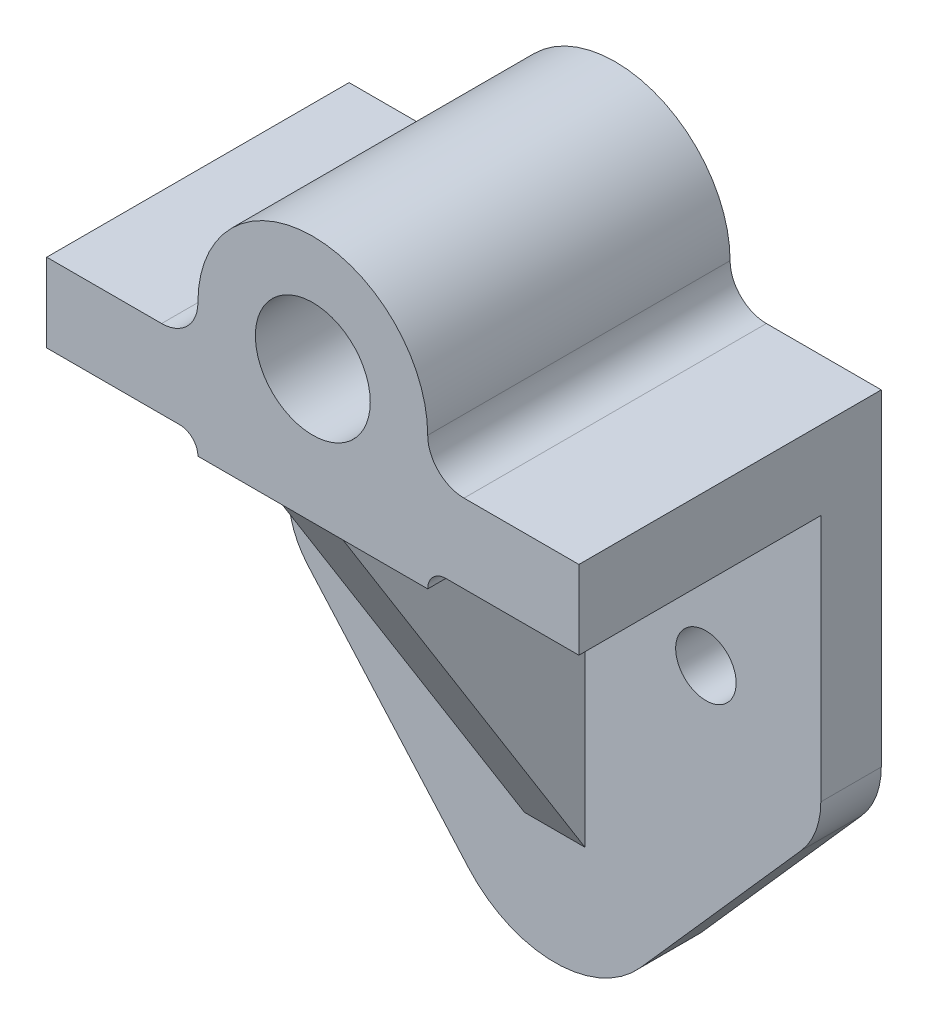
ISO-10303-21;
HEADER;
FILE_DESCRIPTION(('STEP AP214'),'2;1');
FILE_NAME('part.step','',(''),(''),'','','');
FILE_SCHEMA(('AUTOMOTIVE_DESIGN { 1 0 10303 214 1 1 1 1 }'));
ENDSEC;
DATA;
#1=APPLICATION_CONTEXT('core data for automotive mechanical design processes');
#2=APPLICATION_PROTOCOL_DEFINITION('international standard','automotive_design',2000,#1);
#3=PRODUCT_CONTEXT('',#1,'mechanical');
#4=PRODUCT('Part','Part','',(#3));
#5=PRODUCT_RELATED_PRODUCT_CATEGORY('part','',(#4));
#6=PRODUCT_DEFINITION_FORMATION('','',#4);
#7=PRODUCT_DEFINITION_CONTEXT('part definition',#1,'design');
#8=PRODUCT_DEFINITION('design','',#6,#7);
#9=PRODUCT_DEFINITION_SHAPE('','',#8);
#10=(LENGTH_UNIT() NAMED_UNIT(*) SI_UNIT(.MILLI.,.METRE.));
#11=(NAMED_UNIT(*) PLANE_ANGLE_UNIT() SI_UNIT($,.RADIAN.));
#12=(NAMED_UNIT(*) SI_UNIT($,.STERADIAN.) SOLID_ANGLE_UNIT());
#13=UNCERTAINTY_MEASURE_WITH_UNIT(LENGTH_MEASURE(1.E-05),#10,'distance_accuracy_value','');
#14=(GEOMETRIC_REPRESENTATION_CONTEXT(3) GLOBAL_UNCERTAINTY_ASSIGNED_CONTEXT((#13)) GLOBAL_UNIT_ASSIGNED_CONTEXT((#10,
#11,#12)) REPRESENTATION_CONTEXT('',''));
#15=CARTESIAN_POINT('',(0.,0.,0.));
#16=DIRECTION('',(0.,0.,1.));
#17=DIRECTION('',(1.,0.,0.));
#18=AXIS2_PLACEMENT_3D('',#15,#16,#17);
#19=CARTESIAN_POINT('',(0.,-22.,50.));
#20=DIRECTION('',(0.,1.,0.));
#21=DIRECTION('',(0.,0.,1.));
#22=AXIS2_PLACEMENT_3D('',#19,#20,#21);
#23=PLANE('',#22);
#24=DIRECTION('',(0.,0.,-1.));
#25=VECTOR('',#24,1.);
#26=CARTESIAN_POINT('',(-5.,-22.,50.));
#27=LINE('',#26,#25);
#28=CARTESIAN_POINT('',(-5.,-22.,50.));
#29=VERTEX_POINT('',#28);
#30=CARTESIAN_POINT('',(-5.,-22.,10.));
#31=VERTEX_POINT('',#30);
#32=EDGE_CURVE('E196',#29,#31,#27,.T.);
#33=ORIENTED_EDGE('',*,*,#32,.F.);
#34=DIRECTION('',(1.,0.,0.));
#35=VECTOR('',#34,1.);
#36=CARTESIAN_POINT('',(0.,-22.,50.));
#37=LINE('',#36,#35);
#38=CARTESIAN_POINT('',(-19.,-22.,50.));
#39=VERTEX_POINT('',#38);
#40=EDGE_CURVE('E190',#39,#29,#37,.T.);
#41=ORIENTED_EDGE('',*,*,#40,.F.);
#42=DIRECTION('',(0.,0.,-1.));
#43=VECTOR('',#42,1.);
#44=CARTESIAN_POINT('',(-19.,-22.,50.));
#45=LINE('',#44,#43);
#46=CARTESIAN_POINT('',(-19.,-22.,10.));
#47=VERTEX_POINT('',#46);
#48=EDGE_CURVE('E355',#39,#47,#45,.T.);
#49=ORIENTED_EDGE('',*,*,#48,.T.);
#50=DIRECTION('',(1.,0.,0.));
#51=VECTOR('',#50,1.);
#52=CARTESIAN_POINT('',(0.,-22.,10.));
#53=LINE('',#52,#51);
#54=EDGE_CURVE('E206',#47,#31,#53,.T.);
#55=ORIENTED_EDGE('',*,*,#54,.T.);
#56=EDGE_LOOP('',(#33,#41,#49,#55));
#57=FACE_BOUND('',#56,.T.);
#58=ADVANCED_FACE('F38',(#57),#23,.F.);
#59=CARTESIAN_POINT('',(-31.,-60.,10.));
#60=DIRECTION('',(0.,0.,-1.));
#61=DIRECTION('',(-1.,0.,0.));
#62=AXIS2_PLACEMENT_3D('',#59,#60,#61);
#63=CYLINDRICAL_SURFACE('',#62,13.);
#64=CARTESIAN_POINT('',(-31.,-60.,0.));
#65=DIRECTION('',(0.,0.,1.));
#66=DIRECTION('',(1.,0.,0.));
#67=AXIS2_PLACEMENT_3D('',#64,#65,#66);
#68=CIRCLE('',#67,13.);
#69=CARTESIAN_POINT('',(-40.7386831643555,-68.6115068498085,0.));
#70=VERTEX_POINT('',#69);
#71=CARTESIAN_POINT('',(-44.,-60.,0.));
#72=VERTEX_POINT('',#71);
#73=EDGE_CURVE('E274',#70,#72,#68,.F.);
#74=ORIENTED_EDGE('',*,*,#73,.F.);
#75=DIRECTION('',(0.,0.,-1.));
#76=VECTOR('',#75,1.);
#77=CARTESIAN_POINT('',(-40.7386831643555,-68.6115068498085,10.));
#78=LINE('',#77,#76);
#79=CARTESIAN_POINT('',(-40.7386831643555,-68.6115068498085,10.));
#80=VERTEX_POINT('',#79);
#81=EDGE_CURVE('E304',#80,#70,#78,.T.);
#82=ORIENTED_EDGE('',*,*,#81,.F.);
#83=CARTESIAN_POINT('',(-31.,-60.,10.));
#84=DIRECTION('',(0.,0.,1.));
#85=DIRECTION('',(1.,0.,0.));
#86=AXIS2_PLACEMENT_3D('',#83,#84,#85);
#87=CIRCLE('',#86,13.);
#88=CARTESIAN_POINT('',(-44.,-60.,10.));
#89=VERTEX_POINT('',#88);
#90=EDGE_CURVE('E336',#80,#89,#87,.F.);
#91=ORIENTED_EDGE('',*,*,#90,.T.);
#92=DIRECTION('',(0.,0.,-1.));
#93=VECTOR('',#92,1.);
#94=CARTESIAN_POINT('',(-44.,-60.,10.));
#95=LINE('',#94,#93);
#96=EDGE_CURVE('E266',#89,#72,#95,.T.);
#97=ORIENTED_EDGE('',*,*,#96,.T.);
#98=EDGE_LOOP('',(#74,#82,#91,#97));
#99=FACE_BOUND('',#98,.T.);
#100=ADVANCED_FACE('F428',(#99),#63,.T.);
#101=CARTESIAN_POINT('',(-56.9101899674589,-50.3232811313158,10.));
#102=DIRECTION('',(-0.749129474181193,-0.662423603831423,0.));
#103=DIRECTION('',(0.662423603831423,-0.749129474181193,0.));
#104=AXIS2_PLACEMENT_3D('',#101,#102,#103);
#105=PLANE('',#104);
#106=DIRECTION('',(-0.662423603831423,0.749129474181193,0.));
#107=VECTOR('',#106,1.);
#108=CARTESIAN_POINT('',(-56.9101899674589,-50.3232811313158,0.));
#109=LINE('',#108,#107);
#110=CARTESIAN_POINT('',(-14.2334600094427,-98.586048472797,0.));
#111=VERTEX_POINT('',#110);
#112=EDGE_CURVE('E277',#111,#70,#109,.T.);
#113=ORIENTED_EDGE('',*,*,#112,.F.);
#114=DIRECTION('',(0.,0.,-1.));
#115=VECTOR('',#114,1.);
#116=CARTESIAN_POINT('',(-14.2334600094427,-98.586048472797,10.));
#117=LINE('',#116,#115);
#118=CARTESIAN_POINT('',(-14.2334600094427,-98.586048472797,10.));
#119=VERTEX_POINT('',#118);
#120=EDGE_CURVE('E302',#119,#111,#117,.T.);
#121=ORIENTED_EDGE('',*,*,#120,.F.);
#122=DIRECTION('',(-0.662423603831423,0.749129474181193,0.));
#123=VECTOR('',#122,1.);
#124=CARTESIAN_POINT('',(-56.9101899674589,-50.3232811313158,10.));
#125=LINE('',#124,#123);
#126=EDGE_CURVE('E333',#119,#80,#125,.T.);
#127=ORIENTED_EDGE('',*,*,#126,.T.);
#128=ORIENTED_EDGE('',*,*,#81,.T.);
#129=EDGE_LOOP('',(#113,#121,#127,#128));
#130=FACE_BOUND('',#129,.T.);
#131=ADVANCED_FACE('F432',(#130),#105,.T.);
#132=CARTESIAN_POINT('',(0.,-86.,10.));
#133=DIRECTION('',(0.,0.,-1.));
#134=DIRECTION('',(-1.,0.,0.));
#135=AXIS2_PLACEMENT_3D('',#132,#133,#134);
#136=CYLINDRICAL_SURFACE('',#135,19.);
#137=CARTESIAN_POINT('',(0.,-86.,0.));
#138=DIRECTION('',(0.,0.,1.));
#139=DIRECTION('',(1.,0.,0.));
#140=AXIS2_PLACEMENT_3D('',#137,#138,#139);
#141=CIRCLE('',#140,19.);
#142=CARTESIAN_POINT('',(14.2334600094427,-98.586048472797,0.));
#143=VERTEX_POINT('',#142);
#144=EDGE_CURVE('E280',#143,#111,#141,.F.);
#145=ORIENTED_EDGE('',*,*,#144,.F.);
#146=DIRECTION('',(0.,0.,-1.));
#147=VECTOR('',#146,1.);
#148=CARTESIAN_POINT('',(14.2334600094427,-98.586048472797,10.));
#149=LINE('',#148,#147);
#150=CARTESIAN_POINT('',(14.2334600094427,-98.586048472797,10.));
#151=VERTEX_POINT('',#150);
#152=EDGE_CURVE('E300',#151,#143,#149,.T.);
#153=ORIENTED_EDGE('',*,*,#152,.F.);
#154=CARTESIAN_POINT('',(0.,-86.,10.));
#155=DIRECTION('',(0.,0.,1.));
#156=DIRECTION('',(1.,0.,0.));
#157=AXIS2_PLACEMENT_3D('',#154,#155,#156);
#158=CIRCLE('',#157,19.);
#159=EDGE_CURVE('E330',#151,#119,#158,.F.);
#160=ORIENTED_EDGE('',*,*,#159,.T.);
#161=ORIENTED_EDGE('',*,*,#120,.T.);
#162=EDGE_LOOP('',(#145,#153,#160,#161));
#163=FACE_BOUND('',#162,.T.);
#164=ADVANCED_FACE('F616',(#163),#136,.T.);
#165=CARTESIAN_POINT('',(56.9101899674589,-50.3232811313158,10.));
#166=DIRECTION('',(0.749129474181193,-0.662423603831423,0.));
#167=DIRECTION('',(0.662423603831423,0.749129474181193,0.));
#168=AXIS2_PLACEMENT_3D('',#165,#166,#167);
#169=PLANE('',#168);
#170=DIRECTION('',(-0.662423603831423,-0.749129474181193,0.));
#171=VECTOR('',#170,1.);
#172=CARTESIAN_POINT('',(56.9101899674589,-50.3232811313158,0.));
#173=LINE('',#172,#171);
#174=CARTESIAN_POINT('',(40.7386831643555,-68.6115068498085,0.));
#175=VERTEX_POINT('',#174);
#176=EDGE_CURVE('E283',#175,#143,#173,.T.);
#177=ORIENTED_EDGE('',*,*,#176,.F.);
#178=DIRECTION('',(0.,0.,-1.));
#179=VECTOR('',#178,1.);
#180=CARTESIAN_POINT('',(40.7386831643555,-68.6115068498085,10.));
#181=LINE('',#180,#179);
#182=CARTESIAN_POINT('',(40.7386831643555,-68.6115068498085,10.));
#183=VERTEX_POINT('',#182);
#184=EDGE_CURVE('E298',#183,#175,#181,.T.);
#185=ORIENTED_EDGE('',*,*,#184,.F.);
#186=DIRECTION('',(-0.662423603831423,-0.749129474181193,0.));
#187=VECTOR('',#186,1.);
#188=CARTESIAN_POINT('',(56.9101899674589,-50.3232811313158,10.));
#189=LINE('',#188,#187);
#190=EDGE_CURVE('E325',#183,#151,#189,.T.);
#191=ORIENTED_EDGE('',*,*,#190,.T.);
#192=ORIENTED_EDGE('',*,*,#152,.T.);
#193=EDGE_LOOP('',(#177,#185,#191,#192));
#194=FACE_BOUND('',#193,.T.);
#195=ADVANCED_FACE('F606',(#194),#169,.T.);
#196=CARTESIAN_POINT('',(31.,-60.,10.));
#197=DIRECTION('',(0.,0.,-1.));
#198=DIRECTION('',(-1.,0.,0.));
#199=AXIS2_PLACEMENT_3D('',#196,#197,#198);
#200=CYLINDRICAL_SURFACE('',#199,13.);
#201=CARTESIAN_POINT('',(31.,-60.,0.));
#202=DIRECTION('',(0.,0.,1.));
#203=DIRECTION('',(1.,0.,0.));
#204=AXIS2_PLACEMENT_3D('',#201,#202,#203);
#205=CIRCLE('',#204,13.);
#206=CARTESIAN_POINT('',(44.,-60.,0.));
#207=VERTEX_POINT('',#206);
#208=EDGE_CURVE('E286',#207,#175,#205,.F.);
#209=ORIENTED_EDGE('',*,*,#208,.F.);
#210=DIRECTION('',(0.,0.,-1.));
#211=VECTOR('',#210,1.);
#212=CARTESIAN_POINT('',(44.,-60.,10.));
#213=LINE('',#212,#211);
#214=CARTESIAN_POINT('',(44.,-60.,10.));
#215=VERTEX_POINT('',#214);
#216=EDGE_CURVE('E296',#215,#207,#213,.T.);
#217=ORIENTED_EDGE('',*,*,#216,.F.);
#218=CARTESIAN_POINT('',(31.,-60.,10.));
#219=DIRECTION('',(0.,0.,1.));
#220=DIRECTION('',(1.,0.,0.));
#221=AXIS2_PLACEMENT_3D('',#218,#219,#220);
#222=CIRCLE('',#221,13.);
#223=EDGE_CURVE('E323',#215,#183,#222,.F.);
#224=ORIENTED_EDGE('',*,*,#223,.T.);
#225=ORIENTED_EDGE('',*,*,#184,.T.);
#226=EDGE_LOOP('',(#209,#217,#224,#225));
#227=FACE_BOUND('',#226,.T.);
#228=ADVANCED_FACE('F578',(#227),#200,.T.);
#229=CARTESIAN_POINT('',(44.,0.,10.));
#230=DIRECTION('',(1.,0.,0.));
#231=DIRECTION('',(0.,0.,-1.));
#232=AXIS2_PLACEMENT_3D('',#229,#230,#231);
#233=PLANE('',#232);
#234=DIRECTION('',(0.,-1.,0.));
#235=VECTOR('',#234,1.);
#236=CARTESIAN_POINT('',(44.,0.,0.));
#237=LINE('',#236,#235);
#238=CARTESIAN_POINT('',(44.,-6.,0.));
#239=VERTEX_POINT('',#238);
#240=EDGE_CURVE('E289',#239,#207,#237,.T.);
#241=ORIENTED_EDGE('',*,*,#240,.F.);
#242=DIRECTION('',(0.,0.,-1.));
#243=VECTOR('',#242,1.);
#244=CARTESIAN_POINT('',(44.,-6.,50.));
#245=LINE('',#244,#243);
#246=CARTESIAN_POINT('',(44.,-6.,50.));
#247=VERTEX_POINT('',#246);
#248=EDGE_CURVE('E361',#247,#239,#245,.T.);
#249=ORIENTED_EDGE('',*,*,#248,.F.);
#250=DIRECTION('',(0.,-1.,0.));
#251=VECTOR('',#250,1.);
#252=CARTESIAN_POINT('',(44.,0.,50.));
#253=LINE('',#252,#251);
#254=CARTESIAN_POINT('',(44.,-19.,50.));
#255=VERTEX_POINT('',#254);
#256=EDGE_CURVE('E211',#247,#255,#253,.T.);
#257=ORIENTED_EDGE('',*,*,#256,.T.);
#258=DIRECTION('',(0.,0.,-1.));
#259=VECTOR('',#258,1.);
#260=CARTESIAN_POINT('',(44.,-19.,50.));
#261=LINE('',#260,#259);
#262=CARTESIAN_POINT('',(44.,-19.,10.));
#263=VERTEX_POINT('',#262);
#264=EDGE_CURVE('E359',#255,#263,#261,.T.);
#265=ORIENTED_EDGE('',*,*,#264,.T.);
#266=DIRECTION('',(0.,-1.,0.));
#267=VECTOR('',#266,1.);
#268=CARTESIAN_POINT('',(44.,0.,10.));
#269=LINE('',#268,#267);
#270=EDGE_CURVE('E258',#263,#215,#269,.T.);
#271=ORIENTED_EDGE('',*,*,#270,.T.);
#272=ORIENTED_EDGE('',*,*,#216,.T.);
#273=EDGE_LOOP('',(#241,#249,#257,#265,#271,#272));
#274=FACE_BOUND('',#273,.T.);
#275=ADVANCED_FACE('F389',(#274),#233,.T.);
#276=CARTESIAN_POINT('',(-25.,-50.,10.));
#277=DIRECTION('',(0.,0.,-1.));
#278=DIRECTION('',(-1.,0.,0.));
#279=AXIS2_PLACEMENT_3D('',#276,#277,#278);
#280=CYLINDRICAL_SURFACE('',#279,5.);
#281=CARTESIAN_POINT('',(-25.,-50.,10.));
#282=DIRECTION('',(0.,0.,1.));
#283=DIRECTION('',(1.,0.,0.));
#284=AXIS2_PLACEMENT_3D('',#281,#282,#283);
#285=CIRCLE('',#284,5.);
#286=CARTESIAN_POINT('',(-20.,-50.,10.));
#287=VERTEX_POINT('',#286);
#288=EDGE_CURVE('E339',#287,#287,#285,.T.);
#289=ORIENTED_EDGE('',*,*,#288,.T.);
#290=EDGE_LOOP('',(#289));
#291=FACE_BOUND('',#290,.T.);
#292=CARTESIAN_POINT('',(-25.,-50.,0.));
#293=DIRECTION('',(0.,0.,1.));
#294=DIRECTION('',(1.,0.,0.));
#295=AXIS2_PLACEMENT_3D('',#292,#293,#294);
#296=CIRCLE('',#295,5.);
#297=CARTESIAN_POINT('',(-20.,-50.,0.));
#298=VERTEX_POINT('',#297);
#299=EDGE_CURVE('E270',#298,#298,#296,.T.);
#300=ORIENTED_EDGE('',*,*,#299,.F.);
#301=EDGE_LOOP('',(#300));
#302=FACE_BOUND('',#301,.T.);
#303=ADVANCED_FACE('F577',(#291,#302),#280,.F.);
#304=CARTESIAN_POINT('',(25.,-50.,10.));
#305=DIRECTION('',(0.,0.,-1.));
#306=DIRECTION('',(-1.,0.,0.));
#307=AXIS2_PLACEMENT_3D('',#304,#305,#306);
#308=CYLINDRICAL_SURFACE('',#307,5.);
#309=CARTESIAN_POINT('',(25.,-50.,10.));
#310=DIRECTION('',(0.,0.,1.));
#311=DIRECTION('',(1.,0.,0.));
#312=AXIS2_PLACEMENT_3D('',#309,#310,#311);
#313=CIRCLE('',#312,5.);
#314=CARTESIAN_POINT('',(30.,-50.,10.));
#315=VERTEX_POINT('',#314);
#316=EDGE_CURVE('E294',#315,#315,#313,.T.);
#317=ORIENTED_EDGE('',*,*,#316,.T.);
#318=EDGE_LOOP('',(#317));
#319=FACE_BOUND('',#318,.T.);
#320=CARTESIAN_POINT('',(25.,-50.,0.));
#321=DIRECTION('',(0.,0.,1.));
#322=DIRECTION('',(1.,0.,0.));
#323=AXIS2_PLACEMENT_3D('',#320,#321,#322);
#324=CIRCLE('',#323,5.);
#325=CARTESIAN_POINT('',(30.,-50.,0.));
#326=VERTEX_POINT('',#325);
#327=EDGE_CURVE('E267',#326,#326,#324,.T.);
#328=ORIENTED_EDGE('',*,*,#327,.F.);
#329=EDGE_LOOP('',(#328));
#330=FACE_BOUND('',#329,.T.);
#331=ADVANCED_FACE('F566',(#319,#330),#308,.F.);
#332=CARTESIAN_POINT('',(-44.,0.,10.));
#333=DIRECTION('',(-1.,0.,0.));
#334=DIRECTION('',(0.,-1.,0.));
#335=AXIS2_PLACEMENT_3D('',#332,#333,#334);
#336=PLANE('',#335);
#337=DIRECTION('',(0.,1.,0.));
#338=VECTOR('',#337,1.);
#339=CARTESIAN_POINT('',(-44.,0.,0.));
#340=LINE('',#339,#338);
#341=CARTESIAN_POINT('',(-44.,-6.,0.));
#342=VERTEX_POINT('',#341);
#343=EDGE_CURVE('E292',#72,#342,#340,.T.);
#344=ORIENTED_EDGE('',*,*,#343,.F.);
#345=ORIENTED_EDGE('',*,*,#96,.F.);
#346=DIRECTION('',(0.,1.,0.));
#347=VECTOR('',#346,1.);
#348=CARTESIAN_POINT('',(-44.,0.,10.));
#349=LINE('',#348,#347);
#350=CARTESIAN_POINT('',(-44.,-19.,10.));
#351=VERTEX_POINT('',#350);
#352=EDGE_CURVE('E263',#89,#351,#349,.T.);
#353=ORIENTED_EDGE('',*,*,#352,.T.);
#354=DIRECTION('',(0.,0.,-1.));
#355=VECTOR('',#354,1.);
#356=CARTESIAN_POINT('',(-44.,-19.,50.));
#357=LINE('',#356,#355);
#358=CARTESIAN_POINT('',(-44.,-19.,50.));
#359=VERTEX_POINT('',#358);
#360=EDGE_CURVE('E353',#359,#351,#357,.T.);
#361=ORIENTED_EDGE('',*,*,#360,.F.);
#362=DIRECTION('',(0.,1.,0.));
#363=VECTOR('',#362,1.);
#364=CARTESIAN_POINT('',(-44.,0.,50.));
#365=LINE('',#364,#363);
#366=CARTESIAN_POINT('',(-44.,-6.,50.));
#367=VERTEX_POINT('',#366);
#368=EDGE_CURVE('E217',#359,#367,#365,.T.);
#369=ORIENTED_EDGE('',*,*,#368,.T.);
#370=DIRECTION('',(0.,0.,-1.));
#371=VECTOR('',#370,1.);
#372=CARTESIAN_POINT('',(-44.,-6.,50.));
#373=LINE('',#372,#371);
#374=EDGE_CURVE('E350',#367,#342,#373,.T.);
#375=ORIENTED_EDGE('',*,*,#374,.T.);
#376=EDGE_LOOP('',(#344,#345,#353,#361,#369,#375));
#377=FACE_BOUND('',#376,.T.);
#378=ADVANCED_FACE('F414',(#377),#336,.T.);
#379=CARTESIAN_POINT('',(0.,0.,10.));
#380=DIRECTION('',(0.,0.,1.));
#381=DIRECTION('',(1.,0.,0.));
#382=AXIS2_PLACEMENT_3D('',#379,#380,#381);
#383=PLANE('',#382);
#384=ORIENTED_EDGE('',*,*,#54,.F.);
#385=CARTESIAN_POINT('',(-22.,-22.,10.));
#386=DIRECTION('',(0.,0.,1.));
#387=DIRECTION('',(1.,0.,0.));
#388=AXIS2_PLACEMENT_3D('',#385,#386,#387);
#389=CIRCLE('',#388,3.);
#390=CARTESIAN_POINT('',(-22.,-19.,10.));
#391=VERTEX_POINT('',#390);
#392=EDGE_CURVE('E307',#47,#391,#389,.T.);
#393=ORIENTED_EDGE('',*,*,#392,.T.);
#394=DIRECTION('',(1.,0.,0.));
#395=VECTOR('',#394,1.);
#396=CARTESIAN_POINT('',(0.,-19.,10.));
#397=LINE('',#396,#395);
#398=EDGE_CURVE('E257',#351,#391,#397,.T.);
#399=ORIENTED_EDGE('',*,*,#398,.F.);
#400=ORIENTED_EDGE('',*,*,#352,.F.);
#401=ORIENTED_EDGE('',*,*,#90,.F.);
#402=ORIENTED_EDGE('',*,*,#126,.F.);
#403=ORIENTED_EDGE('',*,*,#159,.F.);
#404=ORIENTED_EDGE('',*,*,#190,.F.);
#405=ORIENTED_EDGE('',*,*,#223,.F.);
#406=ORIENTED_EDGE('',*,*,#270,.F.);
#407=DIRECTION('',(1.,0.,0.));
#408=VECTOR('',#407,1.);
#409=CARTESIAN_POINT('',(0.,-19.,10.));
#410=LINE('',#409,#408);
#411=CARTESIAN_POINT('',(22.,-19.,10.));
#412=VERTEX_POINT('',#411);
#413=EDGE_CURVE('E255',#412,#263,#410,.T.);
#414=ORIENTED_EDGE('',*,*,#413,.F.);
#415=CARTESIAN_POINT('',(22.,-22.,10.));
#416=DIRECTION('',(0.,0.,1.));
#417=DIRECTION('',(1.,0.,0.));
#418=AXIS2_PLACEMENT_3D('',#415,#416,#417);
#419=CIRCLE('',#418,3.);
#420=CARTESIAN_POINT('',(19.,-22.,10.));
#421=VERTEX_POINT('',#420);
#422=EDGE_CURVE('E252',#412,#421,#419,.T.);
#423=ORIENTED_EDGE('',*,*,#422,.T.);
#424=CARTESIAN_POINT('',(5.,-22.,10.));
#425=VERTEX_POINT('',#424);
#426=EDGE_CURVE('E250',#425,#421,#53,.T.);
#427=ORIENTED_EDGE('',*,*,#426,.F.);
#428=DIRECTION('',(0.,1.,0.));
#429=VECTOR('',#428,1.);
#430=CARTESIAN_POINT('',(5.,0.,10.));
#431=LINE('',#430,#429);
#432=CARTESIAN_POINT('',(5.,-86.,10.));
#433=VERTEX_POINT('',#432);
#434=EDGE_CURVE('E236',#433,#425,#431,.T.);
#435=ORIENTED_EDGE('',*,*,#434,.F.);
#436=DIRECTION('',(1.,0.,0.));
#437=VECTOR('',#436,1.);
#438=CARTESIAN_POINT('',(0.,-86.,10.));
#439=LINE('',#438,#437);
#440=CARTESIAN_POINT('',(-5.,-86.,10.));
#441=VERTEX_POINT('',#440);
#442=EDGE_CURVE('E233',#441,#433,#439,.T.);
#443=ORIENTED_EDGE('',*,*,#442,.F.);
#444=DIRECTION('',(0.,1.,0.));
#445=VECTOR('',#444,1.);
#446=CARTESIAN_POINT('',(-5.,0.,10.));
#447=LINE('',#446,#445);
#448=EDGE_CURVE('E198',#441,#31,#447,.T.);
#449=ORIENTED_EDGE('',*,*,#448,.T.);
#450=EDGE_LOOP('',(#384,#393,#399,#400,#401,#402,#403,#404,#405,#406,#414,#423,#427,#435,#443,#449));
#451=FACE_BOUND('',#450,.T.);
#452=ORIENTED_EDGE('',*,*,#316,.F.);
#453=EDGE_LOOP('',(#452));
#454=FACE_BOUND('',#453,.T.);
#455=ORIENTED_EDGE('',*,*,#288,.F.);
#456=EDGE_LOOP('',(#455));
#457=FACE_BOUND('',#456,.T.);
#458=ADVANCED_FACE('F247',(#451,#454,#457),#383,.T.);
#459=CARTESIAN_POINT('',(0.,0.,0.));
#460=DIRECTION('',(0.,0.,1.));
#461=DIRECTION('',(1.,0.,0.));
#462=AXIS2_PLACEMENT_3D('',#459,#460,#461);
#463=PLANE('',#462);
#464=CARTESIAN_POINT('',(0.,0.,0.));
#465=DIRECTION('',(0.,0.,1.));
#466=DIRECTION('',(1.,0.,0.));
#467=AXIS2_PLACEMENT_3D('',#464,#465,#466);
#468=CIRCLE('',#467,9.5);
#469=CARTESIAN_POINT('',(9.5,0.,0.));
#470=VERTEX_POINT('',#469);
#471=EDGE_CURVE('E232',#470,#470,#468,.T.);
#472=ORIENTED_EDGE('',*,*,#471,.T.);
#473=EDGE_LOOP('',(#472));
#474=FACE_BOUND('',#473,.T.);
#475=CARTESIAN_POINT('',(-25.,0.,0.));
#476=DIRECTION('',(0.,0.,1.));
#477=DIRECTION('',(1.,0.,0.));
#478=AXIS2_PLACEMENT_3D('',#475,#476,#477);
#479=CIRCLE('',#478,6.);
#480=CARTESIAN_POINT('',(-19.,0.,0.));
#481=VERTEX_POINT('',#480);
#482=CARTESIAN_POINT('',(-25.,-6.,0.));
#483=VERTEX_POINT('',#482);
#484=EDGE_CURVE('E375',#481,#483,#479,.F.);
#485=ORIENTED_EDGE('',*,*,#484,.F.);
#486=CARTESIAN_POINT('',(0.,0.,0.));
#487=DIRECTION('',(0.,0.,1.));
#488=DIRECTION('',(1.,0.,0.));
#489=AXIS2_PLACEMENT_3D('',#486,#487,#488);
#490=CIRCLE('',#489,19.);
#491=CARTESIAN_POINT('',(19.,0.,0.));
#492=VERTEX_POINT('',#491);
#493=EDGE_CURVE('E378',#492,#481,#490,.T.);
#494=ORIENTED_EDGE('',*,*,#493,.F.);
#495=CARTESIAN_POINT('',(25.,0.,0.));
#496=DIRECTION('',(0.,0.,1.));
#497=DIRECTION('',(1.,0.,0.));
#498=AXIS2_PLACEMENT_3D('',#495,#496,#497);
#499=CIRCLE('',#498,6.);
#500=CARTESIAN_POINT('',(25.,-6.,0.));
#501=VERTEX_POINT('',#500);
#502=EDGE_CURVE('E235',#492,#501,#499,.T.);
#503=ORIENTED_EDGE('',*,*,#502,.T.);
#504=DIRECTION('',(1.,0.,0.));
#505=VECTOR('',#504,1.);
#506=CARTESIAN_POINT('',(0.,-6.,0.));
#507=LINE('',#506,#505);
#508=EDGE_CURVE('E369',#501,#239,#507,.T.);
#509=ORIENTED_EDGE('',*,*,#508,.T.);
#510=ORIENTED_EDGE('',*,*,#240,.T.);
#511=ORIENTED_EDGE('',*,*,#208,.T.);
#512=ORIENTED_EDGE('',*,*,#176,.T.);
#513=ORIENTED_EDGE('',*,*,#144,.T.);
#514=ORIENTED_EDGE('',*,*,#112,.T.);
#515=ORIENTED_EDGE('',*,*,#73,.T.);
#516=ORIENTED_EDGE('',*,*,#343,.T.);
#517=DIRECTION('',(1.,0.,0.));
#518=VECTOR('',#517,1.);
#519=CARTESIAN_POINT('',(0.,-6.,0.));
#520=LINE('',#519,#518);
#521=EDGE_CURVE('E372',#342,#483,#520,.T.);
#522=ORIENTED_EDGE('',*,*,#521,.T.);
#523=EDGE_LOOP('',(#485,#494,#503,#509,#510,#511,#512,#513,#514,#515,#516,#522));
#524=FACE_BOUND('',#523,.T.);
#525=ORIENTED_EDGE('',*,*,#327,.T.);
#526=EDGE_LOOP('',(#525));
#527=FACE_BOUND('',#526,.T.);
#528=ORIENTED_EDGE('',*,*,#299,.T.);
#529=EDGE_LOOP('',(#528));
#530=FACE_BOUND('',#529,.T.);
#531=ADVANCED_FACE('F546',(#474,#524,#527,#530),#463,.F.);
#532=CARTESIAN_POINT('',(25.,0.,50.));
#533=DIRECTION('',(0.,0.,-1.));
#534=DIRECTION('',(-1.,0.,0.));
#535=AXIS2_PLACEMENT_3D('',#532,#533,#534);
#536=CYLINDRICAL_SURFACE('',#535,6.);
#537=ORIENTED_EDGE('',*,*,#502,.F.);
#538=DIRECTION('',(0.,0.,-1.));
#539=VECTOR('',#538,1.);
#540=CARTESIAN_POINT('',(19.,0.,50.));
#541=LINE('',#540,#539);
#542=CARTESIAN_POINT('',(19.,0.,50.));
#543=VERTEX_POINT('',#542);
#544=EDGE_CURVE('E271',#543,#492,#541,.T.);
#545=ORIENTED_EDGE('',*,*,#544,.F.);
#546=CARTESIAN_POINT('',(25.,0.,50.));
#547=DIRECTION('',(0.,0.,1.));
#548=DIRECTION('',(1.,0.,0.));
#549=AXIS2_PLACEMENT_3D('',#546,#547,#548);
#550=CIRCLE('',#549,6.);
#551=CARTESIAN_POINT('',(25.,-6.,50.));
#552=VERTEX_POINT('',#551);
#553=EDGE_CURVE('E229',#543,#552,#550,.T.);
#554=ORIENTED_EDGE('',*,*,#553,.T.);
#555=DIRECTION('',(0.,0.,-1.));
#556=VECTOR('',#555,1.);
#557=CARTESIAN_POINT('',(25.,-6.,50.));
#558=LINE('',#557,#556);
#559=EDGE_CURVE('E364',#552,#501,#558,.T.);
#560=ORIENTED_EDGE('',*,*,#559,.T.);
#561=EDGE_LOOP('',(#537,#545,#554,#560));
#562=FACE_BOUND('',#561,.T.);
#563=ADVANCED_FACE('F397',(#562),#536,.F.);
#564=CARTESIAN_POINT('',(0.,0.,50.));
#565=DIRECTION('',(0.,0.,-1.));
#566=DIRECTION('',(-1.,0.,0.));
#567=AXIS2_PLACEMENT_3D('',#564,#565,#566);
#568=CYLINDRICAL_SURFACE('',#567,19.);
#569=ORIENTED_EDGE('',*,*,#493,.T.);
#570=DIRECTION('',(0.,0.,-1.));
#571=VECTOR('',#570,1.);
#572=CARTESIAN_POINT('',(-19.,0.,50.));
#573=LINE('',#572,#571);
#574=CARTESIAN_POINT('',(-19.,0.,50.));
#575=VERTEX_POINT('',#574);
#576=EDGE_CURVE('E345',#575,#481,#573,.T.);
#577=ORIENTED_EDGE('',*,*,#576,.F.);
#578=CARTESIAN_POINT('',(0.,0.,50.));
#579=DIRECTION('',(0.,0.,1.));
#580=DIRECTION('',(1.,0.,0.));
#581=AXIS2_PLACEMENT_3D('',#578,#579,#580);
#582=CIRCLE('',#581,19.);
#583=EDGE_CURVE('E227',#543,#575,#582,.T.);
#584=ORIENTED_EDGE('',*,*,#583,.F.);
#585=ORIENTED_EDGE('',*,*,#544,.T.);
#586=EDGE_LOOP('',(#569,#577,#584,#585));
#587=FACE_BOUND('',#586,.T.);
#588=ADVANCED_FACE('F404',(#587),#568,.T.);
#589=CARTESIAN_POINT('',(-25.,0.,50.));
#590=DIRECTION('',(0.,0.,-1.));
#591=DIRECTION('',(-1.,0.,0.));
#592=AXIS2_PLACEMENT_3D('',#589,#590,#591);
#593=CYLINDRICAL_SURFACE('',#592,6.);
#594=ORIENTED_EDGE('',*,*,#484,.T.);
#595=DIRECTION('',(0.,0.,-1.));
#596=VECTOR('',#595,1.);
#597=CARTESIAN_POINT('',(-25.,-6.,50.));
#598=LINE('',#597,#596);
#599=CARTESIAN_POINT('',(-25.,-6.,50.));
#600=VERTEX_POINT('',#599);
#601=EDGE_CURVE('E348',#600,#483,#598,.T.);
#602=ORIENTED_EDGE('',*,*,#601,.F.);
#603=CARTESIAN_POINT('',(-25.,0.,50.));
#604=DIRECTION('',(0.,0.,1.));
#605=DIRECTION('',(1.,0.,0.));
#606=AXIS2_PLACEMENT_3D('',#603,#604,#605);
#607=CIRCLE('',#606,6.);
#608=EDGE_CURVE('E225',#575,#600,#607,.F.);
#609=ORIENTED_EDGE('',*,*,#608,.F.);
#610=ORIENTED_EDGE('',*,*,#576,.T.);
#611=EDGE_LOOP('',(#594,#602,#609,#610));
#612=FACE_BOUND('',#611,.T.);
#613=ADVANCED_FACE('F408',(#612),#593,.F.);
#614=CARTESIAN_POINT('',(0.,-6.,50.));
#615=DIRECTION('',(0.,1.,0.));
#616=DIRECTION('',(0.,0.,1.));
#617=AXIS2_PLACEMENT_3D('',#614,#615,#616);
#618=PLANE('',#617);
#619=ORIENTED_EDGE('',*,*,#521,.F.);
#620=ORIENTED_EDGE('',*,*,#374,.F.);
#621=DIRECTION('',(1.,0.,0.));
#622=VECTOR('',#621,1.);
#623=CARTESIAN_POINT('',(0.,-6.,50.));
#624=LINE('',#623,#622);
#625=EDGE_CURVE('E220',#367,#600,#624,.T.);
#626=ORIENTED_EDGE('',*,*,#625,.T.);
#627=ORIENTED_EDGE('',*,*,#601,.T.);
#628=EDGE_LOOP('',(#619,#620,#626,#627));
#629=FACE_BOUND('',#628,.T.);
#630=ADVANCED_FACE('F411',(#629),#618,.T.);
#631=CARTESIAN_POINT('',(0.,-19.,50.));
#632=DIRECTION('',(0.,1.,0.));
#633=DIRECTION('',(0.,0.,1.));
#634=AXIS2_PLACEMENT_3D('',#631,#632,#633);
#635=PLANE('',#634);
#636=ORIENTED_EDGE('',*,*,#398,.T.);
#637=DIRECTION('',(0.,0.,-1.));
#638=VECTOR('',#637,1.);
#639=CARTESIAN_POINT('',(-22.,-19.,50.));
#640=LINE('',#639,#638);
#641=CARTESIAN_POINT('',(-22.,-19.,50.));
#642=VERTEX_POINT('',#641);
#643=EDGE_CURVE('E59',#391,#642,#640,.F.);
#644=ORIENTED_EDGE('',*,*,#643,.T.);
#645=DIRECTION('',(1.,0.,0.));
#646=VECTOR('',#645,1.);
#647=CARTESIAN_POINT('',(0.,-19.,50.));
#648=LINE('',#647,#646);
#649=EDGE_CURVE('E214',#359,#642,#648,.T.);
#650=ORIENTED_EDGE('',*,*,#649,.F.);
#651=ORIENTED_EDGE('',*,*,#360,.T.);
#652=EDGE_LOOP('',(#636,#644,#650,#651));
#653=FACE_BOUND('',#652,.T.);
#654=ADVANCED_FACE('F417',(#653),#635,.F.);
#655=CARTESIAN_POINT('',(5.,-22.,50.));
#656=VERTEX_POINT('',#655);
#657=CARTESIAN_POINT('',(19.,-22.,50.));
#658=VERTEX_POINT('',#657);
#659=EDGE_CURVE('E191',#656,#658,#37,.T.);
#660=ORIENTED_EDGE('',*,*,#659,.F.);
#661=DIRECTION('',(0.,0.,-1.));
#662=VECTOR('',#661,1.);
#663=CARTESIAN_POINT('',(5.,-22.,50.));
#664=LINE('',#663,#662);
#665=EDGE_CURVE('E238',#656,#425,#664,.T.);
#666=ORIENTED_EDGE('',*,*,#665,.T.);
#667=ORIENTED_EDGE('',*,*,#426,.T.);
#668=DIRECTION('',(0.,0.,-1.));
#669=VECTOR('',#668,1.);
#670=CARTESIAN_POINT('',(19.,-22.,50.));
#671=LINE('',#670,#669);
#672=EDGE_CURVE('E357',#658,#421,#671,.T.);
#673=ORIENTED_EDGE('',*,*,#672,.F.);
#674=EDGE_LOOP('',(#660,#666,#667,#673));
#675=FACE_BOUND('',#674,.T.);
#676=ADVANCED_FACE('F419',(#675),#23,.F.);
#677=CARTESIAN_POINT('',(0.,-19.,50.));
#678=DIRECTION('',(0.,1.,0.));
#679=DIRECTION('',(0.,0.,1.));
#680=AXIS2_PLACEMENT_3D('',#677,#678,#679);
#681=PLANE('',#680);
#682=DIRECTION('',(1.,0.,0.));
#683=VECTOR('',#682,1.);
#684=CARTESIAN_POINT('',(0.,-19.,50.));
#685=LINE('',#684,#683);
#686=CARTESIAN_POINT('',(22.,-19.,50.));
#687=VERTEX_POINT('',#686);
#688=EDGE_CURVE('E210',#687,#255,#685,.T.);
#689=ORIENTED_EDGE('',*,*,#688,.F.);
#690=DIRECTION('',(0.,0.,-1.));
#691=VECTOR('',#690,1.);
#692=CARTESIAN_POINT('',(22.,-19.,10.));
#693=LINE('',#692,#691);
#694=EDGE_CURVE('E310',#687,#412,#693,.T.);
#695=ORIENTED_EDGE('',*,*,#694,.T.);
#696=ORIENTED_EDGE('',*,*,#413,.T.);
#697=ORIENTED_EDGE('',*,*,#264,.F.);
#698=EDGE_LOOP('',(#689,#695,#696,#697));
#699=FACE_BOUND('',#698,.T.);
#700=ADVANCED_FACE('F314',(#699),#681,.F.);
#701=CARTESIAN_POINT('',(0.,-6.,50.));
#702=DIRECTION('',(0.,1.,0.));
#703=DIRECTION('',(0.,0.,1.));
#704=AXIS2_PLACEMENT_3D('',#701,#702,#703);
#705=PLANE('',#704);
#706=ORIENTED_EDGE('',*,*,#508,.F.);
#707=ORIENTED_EDGE('',*,*,#559,.F.);
#708=DIRECTION('',(1.,0.,0.));
#709=VECTOR('',#708,1.);
#710=CARTESIAN_POINT('',(0.,-6.,50.));
#711=LINE('',#710,#709);
#712=EDGE_CURVE('E384',#552,#247,#711,.T.);
#713=ORIENTED_EDGE('',*,*,#712,.T.);
#714=ORIENTED_EDGE('',*,*,#248,.T.);
#715=EDGE_LOOP('',(#706,#707,#713,#714));
#716=FACE_BOUND('',#715,.T.);
#717=ADVANCED_FACE('F394',(#716),#705,.T.);
#718=CARTESIAN_POINT('',(0.,0.,50.));
#719=DIRECTION('',(0.,0.,-1.));
#720=DIRECTION('',(-1.,0.,0.));
#721=AXIS2_PLACEMENT_3D('',#718,#719,#720);
#722=CYLINDRICAL_SURFACE('',#721,9.5);
#723=ORIENTED_EDGE('',*,*,#471,.F.);
#724=EDGE_LOOP('',(#723));
#725=FACE_BOUND('',#724,.T.);
#726=CARTESIAN_POINT('',(0.,0.,50.));
#727=DIRECTION('',(0.,0.,1.));
#728=DIRECTION('',(1.,0.,0.));
#729=AXIS2_PLACEMENT_3D('',#726,#727,#728);
#730=CIRCLE('',#729,9.5);
#731=CARTESIAN_POINT('',(9.5,0.,50.));
#732=VERTEX_POINT('',#731);
#733=EDGE_CURVE('E366',#732,#732,#730,.T.);
#734=ORIENTED_EDGE('',*,*,#733,.T.);
#735=EDGE_LOOP('',(#734));
#736=FACE_BOUND('',#735,.T.);
#737=ADVANCED_FACE('F440',(#725,#736),#722,.F.);
#738=CARTESIAN_POINT('',(0.,0.,50.));
#739=DIRECTION('',(0.,0.,1.));
#740=DIRECTION('',(1.,0.,0.));
#741=AXIS2_PLACEMENT_3D('',#738,#739,#740);
#742=PLANE('',#741);
#743=ORIENTED_EDGE('',*,*,#733,.F.);
#744=EDGE_LOOP('',(#743));
#745=FACE_BOUND('',#744,.T.);
#746=EDGE_CURVE('E181',#29,#656,#37,.T.);
#747=ORIENTED_EDGE('',*,*,#746,.T.);
#748=ORIENTED_EDGE('',*,*,#659,.T.);
#749=CARTESIAN_POINT('',(22.,-22.,50.));
#750=DIRECTION('',(0.,0.,1.));
#751=DIRECTION('',(1.,0.,0.));
#752=AXIS2_PLACEMENT_3D('',#749,#750,#751);
#753=CIRCLE('',#752,3.);
#754=EDGE_CURVE('E11',#658,#687,#753,.F.);
#755=ORIENTED_EDGE('',*,*,#754,.T.);
#756=ORIENTED_EDGE('',*,*,#688,.T.);
#757=ORIENTED_EDGE('',*,*,#256,.F.);
#758=ORIENTED_EDGE('',*,*,#712,.F.);
#759=ORIENTED_EDGE('',*,*,#553,.F.);
#760=ORIENTED_EDGE('',*,*,#583,.T.);
#761=ORIENTED_EDGE('',*,*,#608,.T.);
#762=ORIENTED_EDGE('',*,*,#625,.F.);
#763=ORIENTED_EDGE('',*,*,#368,.F.);
#764=ORIENTED_EDGE('',*,*,#649,.T.);
#765=CARTESIAN_POINT('',(-22.,-22.,50.));
#766=DIRECTION('',(0.,0.,1.));
#767=DIRECTION('',(1.,0.,0.));
#768=AXIS2_PLACEMENT_3D('',#765,#766,#767);
#769=CIRCLE('',#768,3.);
#770=EDGE_CURVE('E46',#642,#39,#769,.F.);
#771=ORIENTED_EDGE('',*,*,#770,.T.);
#772=ORIENTED_EDGE('',*,*,#40,.T.);
#773=EDGE_LOOP('',(#747,#748,#755,#756,#757,#758,#759,#760,#761,#762,#763,#764,#771,#772));
#774=FACE_BOUND('',#773,.T.);
#775=ADVANCED_FACE('F208',(#745,#774),#742,.T.);
#776=CARTESIAN_POINT('',(0.,-22.,50.));
#777=DIRECTION('',(0.,-0.52999894000318,0.847998304005088));
#778=DIRECTION('',(0.,-0.847998304005088,-0.52999894000318));
#779=AXIS2_PLACEMENT_3D('',#776,#777,#778);
#780=PLANE('',#779);
#781=DIRECTION('',(0.,-0.847998304005088,-0.52999894000318));
#782=VECTOR('',#781,1.);
#783=CARTESIAN_POINT('',(-5.,-22.,50.));
#784=LINE('',#783,#782);
#785=EDGE_CURVE('E184',#29,#441,#784,.T.);
#786=ORIENTED_EDGE('',*,*,#785,.T.);
#787=ORIENTED_EDGE('',*,*,#442,.T.);
#788=DIRECTION('',(0.,-0.847998304005088,-0.52999894000318));
#789=VECTOR('',#788,1.);
#790=CARTESIAN_POINT('',(5.,-22.,50.));
#791=LINE('',#790,#789);
#792=EDGE_CURVE('E187',#656,#433,#791,.T.);
#793=ORIENTED_EDGE('',*,*,#792,.F.);
#794=ORIENTED_EDGE('',*,*,#746,.F.);
#795=EDGE_LOOP('',(#786,#787,#793,#794));
#796=FACE_BOUND('',#795,.T.);
#797=ADVANCED_FACE('F183',(#796),#780,.T.);
#798=CARTESIAN_POINT('',(5.,-43.,25.));
#799=DIRECTION('',(1.,0.,0.));
#800=DIRECTION('',(0.,0.,-1.));
#801=AXIS2_PLACEMENT_3D('',#798,#799,#800);
#802=PLANE('',#801);
#803=ORIENTED_EDGE('',*,*,#792,.T.);
#804=ORIENTED_EDGE('',*,*,#434,.T.);
#805=ORIENTED_EDGE('',*,*,#665,.F.);
#806=EDGE_LOOP('',(#803,#804,#805));
#807=FACE_BOUND('',#806,.T.);
#808=ADVANCED_FACE('F244',(#807),#802,.T.);
#809=CARTESIAN_POINT('',(-5.,-43.,25.));
#810=DIRECTION('',(1.,0.,0.));
#811=DIRECTION('',(0.,0.,-1.));
#812=AXIS2_PLACEMENT_3D('',#809,#810,#811);
#813=PLANE('',#812);
#814=ORIENTED_EDGE('',*,*,#448,.F.);
#815=ORIENTED_EDGE('',*,*,#785,.F.);
#816=ORIENTED_EDGE('',*,*,#32,.T.);
#817=EDGE_LOOP('',(#814,#815,#816));
#818=FACE_BOUND('',#817,.T.);
#819=ADVANCED_FACE('F195',(#818),#813,.F.);
#820=CARTESIAN_POINT('',(-22.,-22.,50.));
#821=DIRECTION('',(0.,0.,1.));
#822=DIRECTION('',(1.,0.,0.));
#823=AXIS2_PLACEMENT_3D('',#820,#821,#822);
#824=CYLINDRICAL_SURFACE('',#823,3.);
#825=ORIENTED_EDGE('',*,*,#770,.F.);
#826=ORIENTED_EDGE('',*,*,#643,.F.);
#827=ORIENTED_EDGE('',*,*,#392,.F.);
#828=ORIENTED_EDGE('',*,*,#48,.F.);
#829=EDGE_LOOP('',(#825,#826,#827,#828));
#830=FACE_BOUND('',#829,.T.);
#831=ADVANCED_FACE('F451',(#830),#824,.F.);
#832=CARTESIAN_POINT('',(22.,-22.,50.));
#833=DIRECTION('',(0.,0.,1.));
#834=DIRECTION('',(1.,0.,0.));
#835=AXIS2_PLACEMENT_3D('',#832,#833,#834);
#836=CYLINDRICAL_SURFACE('',#835,3.);
#837=ORIENTED_EDGE('',*,*,#754,.F.);
#838=ORIENTED_EDGE('',*,*,#672,.T.);
#839=ORIENTED_EDGE('',*,*,#422,.F.);
#840=ORIENTED_EDGE('',*,*,#694,.F.);
#841=EDGE_LOOP('',(#837,#838,#839,#840));
#842=FACE_BOUND('',#841,.T.);
#843=ADVANCED_FACE('F40',(#842),#836,.F.);
#844=CLOSED_SHELL('',(#58,#100,#131,#164,#195,#228,#275,#303,#331,#378,#458,#531,#563,#588,#613,
#630,#654,#676,#700,#717,#737,#775,#797,#808,#819,#831,#843));
#845=MANIFOLD_SOLID_BREP('B2',#844);
#846=ADVANCED_BREP_SHAPE_REPRESENTATION('',(#18,#845),#14);
#847=SHAPE_DEFINITION_REPRESENTATION(#9,#846);
ENDSEC;
END-ISO-10303-21;
